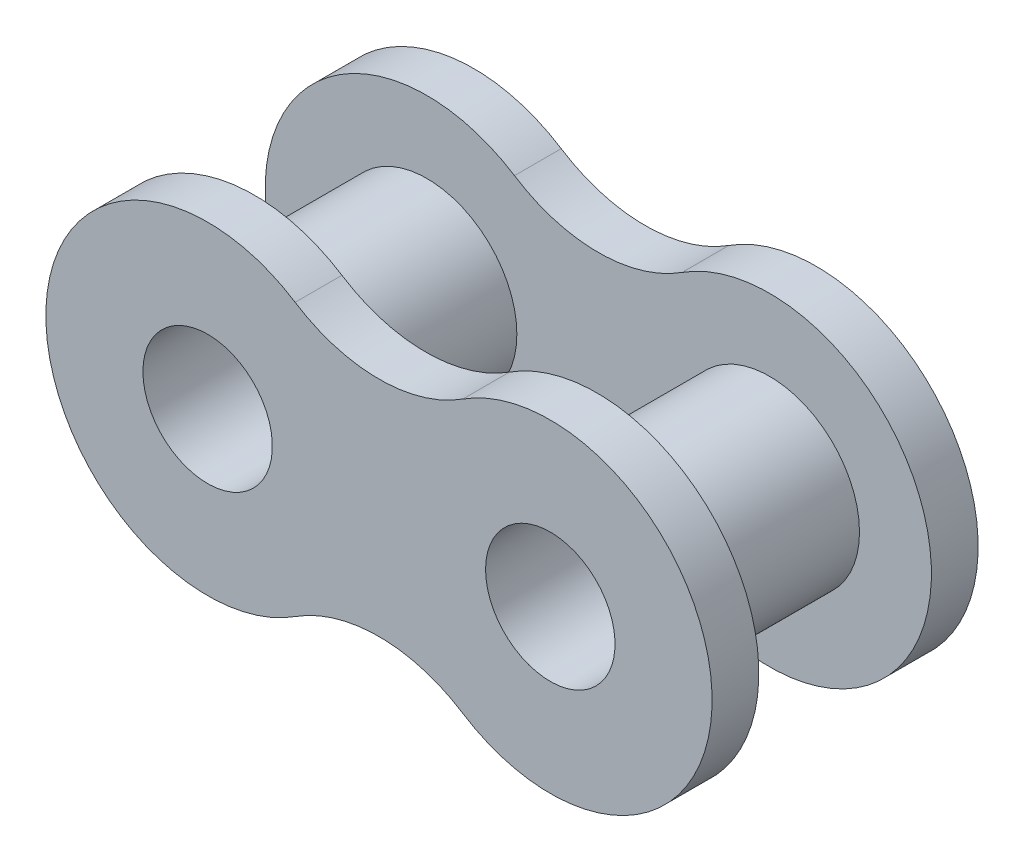
ISO-10303-21;
HEADER;
FILE_DESCRIPTION(('STEP AP214'),'2;1');
FILE_NAME('part.step','',(''),(''),'','','');
FILE_SCHEMA(('AUTOMOTIVE_DESIGN { 1 0 10303 214 1 1 1 1 }'));
ENDSEC;
DATA;
#1=APPLICATION_CONTEXT('core data for automotive mechanical design processes');
#2=APPLICATION_PROTOCOL_DEFINITION('international standard','automotive_design',2000,#1);
#3=PRODUCT_CONTEXT('',#1,'mechanical');
#4=PRODUCT('Part','Part','',(#3));
#5=PRODUCT_RELATED_PRODUCT_CATEGORY('part','',(#4));
#6=PRODUCT_DEFINITION_FORMATION('','',#4);
#7=PRODUCT_DEFINITION_CONTEXT('part definition',#1,'design');
#8=PRODUCT_DEFINITION('design','',#6,#7);
#9=PRODUCT_DEFINITION_SHAPE('','',#8);
#10=(LENGTH_UNIT() NAMED_UNIT(*) SI_UNIT(.MILLI.,.METRE.));
#11=(NAMED_UNIT(*) PLANE_ANGLE_UNIT() SI_UNIT($,.RADIAN.));
#12=(NAMED_UNIT(*) SI_UNIT($,.STERADIAN.) SOLID_ANGLE_UNIT());
#13=UNCERTAINTY_MEASURE_WITH_UNIT(LENGTH_MEASURE(1.E-05),#10,'distance_accuracy_value','');
#14=(GEOMETRIC_REPRESENTATION_CONTEXT(3) GLOBAL_UNCERTAINTY_ASSIGNED_CONTEXT((#13)) GLOBAL_UNIT_ASSIGNED_CONTEXT((#10,
#11,#12)) REPRESENTATION_CONTEXT('',''));
#15=CARTESIAN_POINT('',(0.,0.,0.));
#16=DIRECTION('',(0.,0.,1.));
#17=DIRECTION('',(1.,0.,0.));
#18=AXIS2_PLACEMENT_3D('',#15,#16,#17);
#19=CARTESIAN_POINT('',(-4.765,0.,6.3));
#20=DIRECTION('',(0.,0.,-1.));
#21=DIRECTION('',(-1.,0.,0.));
#22=AXIS2_PLACEMENT_3D('',#19,#20,#21);
#23=CYLINDRICAL_SURFACE('',#22,2.5);
#24=CARTESIAN_POINT('',(-4.765,0.,1.3));
#25=DIRECTION('',(0.,0.,-1.));
#26=DIRECTION('',(-1.,0.,0.));
#27=AXIS2_PLACEMENT_3D('',#24,#25,#26);
#28=CIRCLE('',#27,2.5);
#29=CARTESIAN_POINT('',(-7.265,0.,1.3));
#30=VERTEX_POINT('',#29);
#31=EDGE_CURVE('E185',#30,#30,#28,.F.);
#32=ORIENTED_EDGE('',*,*,#31,.T.);
#33=EDGE_LOOP('',(#32));
#34=FACE_BOUND('',#33,.T.);
#35=CARTESIAN_POINT('',(-4.765,0.,6.1));
#36=DIRECTION('',(0.,0.,1.));
#37=DIRECTION('',(1.,0.,0.));
#38=AXIS2_PLACEMENT_3D('',#35,#36,#37);
#39=CIRCLE('',#38,2.5);
#40=CARTESIAN_POINT('',(-2.265,0.,6.1));
#41=VERTEX_POINT('',#40);
#42=EDGE_CURVE('E11',#41,#41,#39,.T.);
#43=ORIENTED_EDGE('',*,*,#42,.F.);
#44=EDGE_LOOP('',(#43));
#45=FACE_BOUND('',#44,.T.);
#46=ADVANCED_FACE('F41',(#34,#45),#23,.T.);
#47=CARTESIAN_POINT('',(4.765,0.,6.3));
#48=DIRECTION('',(0.,0.,-1.));
#49=DIRECTION('',(-1.,0.,0.));
#50=AXIS2_PLACEMENT_3D('',#47,#48,#49);
#51=CYLINDRICAL_SURFACE('',#50,2.5);
#52=CARTESIAN_POINT('',(4.765,0.,1.3));
#53=DIRECTION('',(0.,0.,-1.));
#54=DIRECTION('',(-1.,0.,0.));
#55=AXIS2_PLACEMENT_3D('',#52,#53,#54);
#56=CIRCLE('',#55,2.5);
#57=CARTESIAN_POINT('',(2.265,0.,1.3));
#58=VERTEX_POINT('',#57);
#59=EDGE_CURVE('E45',#58,#58,#56,.F.);
#60=ORIENTED_EDGE('',*,*,#59,.T.);
#61=EDGE_LOOP('',(#60));
#62=FACE_BOUND('',#61,.T.);
#63=CARTESIAN_POINT('',(4.765,0.,6.1));
#64=DIRECTION('',(0.,0.,1.));
#65=DIRECTION('',(1.,0.,0.));
#66=AXIS2_PLACEMENT_3D('',#63,#64,#65);
#67=CIRCLE('',#66,2.5);
#68=CARTESIAN_POINT('',(7.265,0.,6.1));
#69=VERTEX_POINT('',#68);
#70=EDGE_CURVE('E51',#69,#69,#67,.T.);
#71=ORIENTED_EDGE('',*,*,#70,.F.);
#72=EDGE_LOOP('',(#71));
#73=FACE_BOUND('',#72,.T.);
#74=ADVANCED_FACE('F192',(#62,#73),#51,.T.);
#75=CARTESIAN_POINT('',(4.765,0.,1.3));
#76=DIRECTION('',(0.,0.,-1.));
#77=DIRECTION('',(-1.,0.,0.));
#78=AXIS2_PLACEMENT_3D('',#75,#76,#77);
#79=CYLINDRICAL_SURFACE('',#78,4.5);
#80=CARTESIAN_POINT('',(4.765,0.,0.));
#81=DIRECTION('',(0.,0.,1.));
#82=DIRECTION('',(-1.,0.,0.));
#83=AXIS2_PLACEMENT_3D('',#80,#81,#82);
#84=CIRCLE('',#83,4.5);
#85=CARTESIAN_POINT('',(2.33084421994934,-3.78482306567242,0.));
#86=VERTEX_POINT('',#85);
#87=CARTESIAN_POINT('',(2.33084421994934,3.78482306567242,0.));
#88=VERTEX_POINT('',#87);
#89=EDGE_CURVE('E130',#86,#88,#84,.T.);
#90=ORIENTED_EDGE('',*,*,#89,.T.);
#91=DIRECTION('',(0.,0.,-1.));
#92=VECTOR('',#91,1.);
#93=CARTESIAN_POINT('',(2.33084421994934,3.78482306567242,1.3));
#94=LINE('',#93,#92);
#95=CARTESIAN_POINT('',(2.33084421994934,3.78482306567242,1.3));
#96=VERTEX_POINT('',#95);
#97=EDGE_CURVE('E184',#96,#88,#94,.T.);
#98=ORIENTED_EDGE('',*,*,#97,.F.);
#99=CARTESIAN_POINT('',(4.765,0.,1.3));
#100=DIRECTION('',(0.,0.,1.));
#101=DIRECTION('',(-1.,0.,0.));
#102=AXIS2_PLACEMENT_3D('',#99,#100,#101);
#103=CIRCLE('',#102,4.5);
#104=CARTESIAN_POINT('',(2.33084421994934,-3.78482306567242,1.3));
#105=VERTEX_POINT('',#104);
#106=EDGE_CURVE('E166',#105,#96,#103,.T.);
#107=ORIENTED_EDGE('',*,*,#106,.F.);
#108=DIRECTION('',(0.,0.,-1.));
#109=VECTOR('',#108,1.);
#110=CARTESIAN_POINT('',(2.33084421994934,-3.78482306567242,1.3));
#111=LINE('',#110,#109);
#112=EDGE_CURVE('E172',#105,#86,#111,.T.);
#113=ORIENTED_EDGE('',*,*,#112,.T.);
#114=EDGE_LOOP('',(#90,#98,#107,#113));
#115=FACE_BOUND('',#114,.T.);
#116=ADVANCED_FACE('F43',(#115),#79,.T.);
#117=CARTESIAN_POINT('',(0.,7.40900892857143,1.3));
#118=DIRECTION('',(0.,0.,-1.));
#119=DIRECTION('',(-1.,0.,0.));
#120=AXIS2_PLACEMENT_3D('',#117,#118,#119);
#121=CYLINDRICAL_SURFACE('',#120,4.30900892857143);
#122=CARTESIAN_POINT('',(0.,7.40900892857143,0.));
#123=DIRECTION('',(0.,0.,-1.));
#124=DIRECTION('',(1.,0.,0.));
#125=AXIS2_PLACEMENT_3D('',#122,#123,#124);
#126=CIRCLE('',#125,4.30900892857143);
#127=CARTESIAN_POINT('',(-2.33084421994934,3.78482306567242,0.));
#128=VERTEX_POINT('',#127);
#129=EDGE_CURVE('E175',#88,#128,#126,.T.);
#130=ORIENTED_EDGE('',*,*,#129,.T.);
#131=DIRECTION('',(0.,0.,-1.));
#132=VECTOR('',#131,1.);
#133=CARTESIAN_POINT('',(-2.33084421994934,3.78482306567242,1.3));
#134=LINE('',#133,#132);
#135=CARTESIAN_POINT('',(-2.33084421994934,3.78482306567242,1.3));
#136=VERTEX_POINT('',#135);
#137=EDGE_CURVE('E182',#136,#128,#134,.T.);
#138=ORIENTED_EDGE('',*,*,#137,.F.);
#139=CARTESIAN_POINT('',(0.,7.40900892857143,1.3));
#140=DIRECTION('',(0.,0.,-1.));
#141=DIRECTION('',(1.,0.,0.));
#142=AXIS2_PLACEMENT_3D('',#139,#140,#141);
#143=CIRCLE('',#142,4.30900892857143);
#144=EDGE_CURVE('E92',#96,#136,#143,.T.);
#145=ORIENTED_EDGE('',*,*,#144,.F.);
#146=ORIENTED_EDGE('',*,*,#97,.T.);
#147=EDGE_LOOP('',(#130,#138,#145,#146));
#148=FACE_BOUND('',#147,.T.);
#149=ADVANCED_FACE('F205',(#148),#121,.F.);
#150=CARTESIAN_POINT('',(-4.765,0.,1.3));
#151=DIRECTION('',(0.,0.,-1.));
#152=DIRECTION('',(-1.,0.,0.));
#153=AXIS2_PLACEMENT_3D('',#150,#151,#152);
#154=CYLINDRICAL_SURFACE('',#153,4.5);
#155=CARTESIAN_POINT('',(-4.765,0.,0.));
#156=DIRECTION('',(0.,0.,1.));
#157=DIRECTION('',(1.,0.,0.));
#158=AXIS2_PLACEMENT_3D('',#155,#156,#157);
#159=CIRCLE('',#158,4.5);
#160=CARTESIAN_POINT('',(-2.33084421994934,-3.78482306567242,0.));
#161=VERTEX_POINT('',#160);
#162=EDGE_CURVE('E78',#128,#161,#159,.T.);
#163=ORIENTED_EDGE('',*,*,#162,.T.);
#164=DIRECTION('',(0.,0.,-1.));
#165=VECTOR('',#164,1.);
#166=CARTESIAN_POINT('',(-2.33084421994934,-3.78482306567242,1.3));
#167=LINE('',#166,#165);
#168=CARTESIAN_POINT('',(-2.33084421994934,-3.78482306567242,1.3));
#169=VERTEX_POINT('',#168);
#170=EDGE_CURVE('E180',#169,#161,#167,.T.);
#171=ORIENTED_EDGE('',*,*,#170,.F.);
#172=CARTESIAN_POINT('',(-4.765,0.,1.3));
#173=DIRECTION('',(0.,0.,1.));
#174=DIRECTION('',(1.,0.,0.));
#175=AXIS2_PLACEMENT_3D('',#172,#173,#174);
#176=CIRCLE('',#175,4.5);
#177=EDGE_CURVE('E169',#136,#169,#176,.T.);
#178=ORIENTED_EDGE('',*,*,#177,.F.);
#179=ORIENTED_EDGE('',*,*,#137,.T.);
#180=EDGE_LOOP('',(#163,#171,#178,#179));
#181=FACE_BOUND('',#180,.T.);
#182=ADVANCED_FACE('F208',(#181),#154,.T.);
#183=CARTESIAN_POINT('',(0.,-7.40900892857143,1.3));
#184=DIRECTION('',(0.,0.,-1.));
#185=DIRECTION('',(-1.,0.,0.));
#186=AXIS2_PLACEMENT_3D('',#183,#184,#185);
#187=CYLINDRICAL_SURFACE('',#186,4.30900892857143);
#188=CARTESIAN_POINT('',(0.,-7.40900892857143,0.));
#189=DIRECTION('',(0.,0.,-1.));
#190=DIRECTION('',(-1.,0.,0.));
#191=AXIS2_PLACEMENT_3D('',#188,#189,#190);
#192=CIRCLE('',#191,4.30900892857143);
#193=EDGE_CURVE('E84',#161,#86,#192,.T.);
#194=ORIENTED_EDGE('',*,*,#193,.T.);
#195=ORIENTED_EDGE('',*,*,#112,.F.);
#196=CARTESIAN_POINT('',(0.,-7.40900892857143,1.3));
#197=DIRECTION('',(0.,0.,-1.));
#198=DIRECTION('',(-1.,0.,0.));
#199=AXIS2_PLACEMENT_3D('',#196,#197,#198);
#200=CIRCLE('',#199,4.30900892857143);
#201=EDGE_CURVE('E60',#169,#105,#200,.T.);
#202=ORIENTED_EDGE('',*,*,#201,.F.);
#203=ORIENTED_EDGE('',*,*,#170,.T.);
#204=EDGE_LOOP('',(#194,#195,#202,#203));
#205=FACE_BOUND('',#204,.T.);
#206=ADVANCED_FACE('F199',(#205),#187,.F.);
#207=CARTESIAN_POINT('',(2.3825,-3.70450446428571,1.3));
#208=DIRECTION('',(0.,0.,-1.));
#209=DIRECTION('',(-1.,0.,0.));
#210=AXIS2_PLACEMENT_3D('',#207,#208,#209);
#211=PLANE('',#210);
#212=ORIENTED_EDGE('',*,*,#59,.F.);
#213=EDGE_LOOP('',(#212));
#214=FACE_BOUND('',#213,.T.);
#215=ORIENTED_EDGE('',*,*,#31,.F.);
#216=EDGE_LOOP('',(#215));
#217=FACE_BOUND('',#216,.T.);
#218=ORIENTED_EDGE('',*,*,#106,.T.);
#219=ORIENTED_EDGE('',*,*,#144,.T.);
#220=ORIENTED_EDGE('',*,*,#177,.T.);
#221=ORIENTED_EDGE('',*,*,#201,.T.);
#222=EDGE_LOOP('',(#218,#219,#220,#221));
#223=FACE_BOUND('',#222,.T.);
#224=ADVANCED_FACE('F195',(#214,#217,#223),#211,.F.);
#225=CARTESIAN_POINT('',(2.3825,-3.70450446428571,0.));
#226=DIRECTION('',(0.,0.,-1.));
#227=DIRECTION('',(-1.,0.,0.));
#228=AXIS2_PLACEMENT_3D('',#225,#226,#227);
#229=PLANE('',#228);
#230=CARTESIAN_POINT('',(4.765,0.,0.));
#231=DIRECTION('',(0.,0.,-1.));
#232=DIRECTION('',(-1.,0.,0.));
#233=AXIS2_PLACEMENT_3D('',#230,#231,#232);
#234=CIRCLE('',#233,1.8);
#235=CARTESIAN_POINT('',(2.965,0.,0.));
#236=VERTEX_POINT('',#235);
#237=EDGE_CURVE('E396',#236,#236,#234,.T.);
#238=ORIENTED_EDGE('',*,*,#237,.F.);
#239=EDGE_LOOP('',(#238));
#240=FACE_BOUND('',#239,.T.);
#241=CARTESIAN_POINT('',(-4.765,0.,0.));
#242=DIRECTION('',(0.,0.,-1.));
#243=DIRECTION('',(-1.,0.,0.));
#244=AXIS2_PLACEMENT_3D('',#241,#242,#243);
#245=CIRCLE('',#244,1.8);
#246=CARTESIAN_POINT('',(-6.565,0.,0.));
#247=VERTEX_POINT('',#246);
#248=EDGE_CURVE('E397',#247,#247,#245,.T.);
#249=ORIENTED_EDGE('',*,*,#248,.F.);
#250=EDGE_LOOP('',(#249));
#251=FACE_BOUND('',#250,.T.);
#252=ORIENTED_EDGE('',*,*,#89,.F.);
#253=ORIENTED_EDGE('',*,*,#193,.F.);
#254=ORIENTED_EDGE('',*,*,#162,.F.);
#255=ORIENTED_EDGE('',*,*,#129,.F.);
#256=EDGE_LOOP('',(#252,#253,#254,#255));
#257=FACE_BOUND('',#256,.T.);
#258=ADVANCED_FACE('F198',(#240,#251,#257),#229,.T.);
#259=CARTESIAN_POINT('',(2.3825,-3.70450446428571,7.4));
#260=DIRECTION('',(0.,0.,1.));
#261=DIRECTION('',(-1.,0.,0.));
#262=AXIS2_PLACEMENT_3D('',#259,#260,#261);
#263=PLANE('',#262);
#264=CARTESIAN_POINT('',(4.765,0.,7.4));
#265=DIRECTION('',(0.,0.,-1.));
#266=DIRECTION('',(-1.,0.,0.));
#267=AXIS2_PLACEMENT_3D('',#264,#265,#266);
#268=CIRCLE('',#267,1.8);
#269=CARTESIAN_POINT('',(2.965,0.,7.4));
#270=VERTEX_POINT('',#269);
#271=EDGE_CURVE('E153',#270,#270,#268,.T.);
#272=ORIENTED_EDGE('',*,*,#271,.T.);
#273=EDGE_LOOP('',(#272));
#274=FACE_BOUND('',#273,.T.);
#275=CARTESIAN_POINT('',(-4.765,0.,7.4));
#276=DIRECTION('',(0.,0.,-1.));
#277=DIRECTION('',(-1.,0.,0.));
#278=AXIS2_PLACEMENT_3D('',#275,#276,#277);
#279=CIRCLE('',#278,1.8);
#280=CARTESIAN_POINT('',(-6.565,0.,7.4));
#281=VERTEX_POINT('',#280);
#282=EDGE_CURVE('E401',#281,#281,#279,.T.);
#283=ORIENTED_EDGE('',*,*,#282,.T.);
#284=EDGE_LOOP('',(#283));
#285=FACE_BOUND('',#284,.T.);
#286=CARTESIAN_POINT('',(4.765,0.,7.4));
#287=DIRECTION('',(0.,0.,1.));
#288=DIRECTION('',(-1.,0.,0.));
#289=AXIS2_PLACEMENT_3D('',#286,#287,#288);
#290=CIRCLE('',#289,4.5);
#291=CARTESIAN_POINT('',(2.33084421994934,-3.78482306567242,7.4));
#292=VERTEX_POINT('',#291);
#293=CARTESIAN_POINT('',(2.33084421994934,3.78482306567242,7.4));
#294=VERTEX_POINT('',#293);
#295=EDGE_CURVE('E125',#292,#294,#290,.T.);
#296=ORIENTED_EDGE('',*,*,#295,.T.);
#297=CARTESIAN_POINT('',(0.,7.40900892857143,7.4));
#298=DIRECTION('',(0.,0.,-1.));
#299=DIRECTION('',(1.,0.,0.));
#300=AXIS2_PLACEMENT_3D('',#297,#298,#299);
#301=CIRCLE('',#300,4.30900892857143);
#302=CARTESIAN_POINT('',(-2.33084421994934,3.78482306567242,7.4));
#303=VERTEX_POINT('',#302);
#304=EDGE_CURVE('E141',#294,#303,#301,.T.);
#305=ORIENTED_EDGE('',*,*,#304,.T.);
#306=CARTESIAN_POINT('',(-4.765,0.,7.4));
#307=DIRECTION('',(0.,0.,1.));
#308=DIRECTION('',(1.,0.,0.));
#309=AXIS2_PLACEMENT_3D('',#306,#307,#308);
#310=CIRCLE('',#309,4.5);
#311=CARTESIAN_POINT('',(-2.33084421994934,-3.78482306567242,7.4));
#312=VERTEX_POINT('',#311);
#313=EDGE_CURVE('E155',#303,#312,#310,.T.);
#314=ORIENTED_EDGE('',*,*,#313,.T.);
#315=CARTESIAN_POINT('',(0.,-7.40900892857143,7.4));
#316=DIRECTION('',(0.,0.,-1.));
#317=DIRECTION('',(-1.,0.,0.));
#318=AXIS2_PLACEMENT_3D('',#315,#316,#317);
#319=CIRCLE('',#318,4.30900892857143);
#320=EDGE_CURVE('E152',#312,#292,#319,.T.);
#321=ORIENTED_EDGE('',*,*,#320,.T.);
#322=EDGE_LOOP('',(#296,#305,#314,#321));
#323=FACE_BOUND('',#322,.T.);
#324=ADVANCED_FACE('F210',(#274,#285,#323),#263,.T.);
#325=CARTESIAN_POINT('',(2.3825,-3.70450446428571,6.1));
#326=DIRECTION('',(0.,0.,1.));
#327=DIRECTION('',(-1.,0.,0.));
#328=AXIS2_PLACEMENT_3D('',#325,#326,#327);
#329=PLANE('',#328);
#330=ORIENTED_EDGE('',*,*,#42,.T.);
#331=EDGE_LOOP('',(#330));
#332=FACE_BOUND('',#331,.T.);
#333=ORIENTED_EDGE('',*,*,#70,.T.);
#334=EDGE_LOOP('',(#333));
#335=FACE_BOUND('',#334,.T.);
#336=CARTESIAN_POINT('',(4.765,0.,6.1));
#337=DIRECTION('',(0.,0.,1.));
#338=DIRECTION('',(-1.,0.,0.));
#339=AXIS2_PLACEMENT_3D('',#336,#337,#338);
#340=CIRCLE('',#339,4.5);
#341=CARTESIAN_POINT('',(2.33084421994934,-3.78482306567242,6.1));
#342=VERTEX_POINT('',#341);
#343=CARTESIAN_POINT('',(2.33084421994934,3.78482306567242,6.1));
#344=VERTEX_POINT('',#343);
#345=EDGE_CURVE('E122',#342,#344,#340,.T.);
#346=ORIENTED_EDGE('',*,*,#345,.F.);
#347=CARTESIAN_POINT('',(0.,-7.40900892857143,6.1));
#348=DIRECTION('',(0.,0.,-1.));
#349=DIRECTION('',(-1.,0.,0.));
#350=AXIS2_PLACEMENT_3D('',#347,#348,#349);
#351=CIRCLE('',#350,4.30900892857143);
#352=CARTESIAN_POINT('',(-2.33084421994934,-3.78482306567242,6.1));
#353=VERTEX_POINT('',#352);
#354=EDGE_CURVE('E137',#353,#342,#351,.T.);
#355=ORIENTED_EDGE('',*,*,#354,.F.);
#356=CARTESIAN_POINT('',(-4.765,0.,6.1));
#357=DIRECTION('',(0.,0.,1.));
#358=DIRECTION('',(1.,0.,0.));
#359=AXIS2_PLACEMENT_3D('',#356,#357,#358);
#360=CIRCLE('',#359,4.5);
#361=CARTESIAN_POINT('',(-2.33084421994934,3.78482306567242,6.1));
#362=VERTEX_POINT('',#361);
#363=EDGE_CURVE('E144',#362,#353,#360,.T.);
#364=ORIENTED_EDGE('',*,*,#363,.F.);
#365=CARTESIAN_POINT('',(0.,7.40900892857143,6.1));
#366=DIRECTION('',(0.,0.,-1.));
#367=DIRECTION('',(1.,0.,0.));
#368=AXIS2_PLACEMENT_3D('',#365,#366,#367);
#369=CIRCLE('',#368,4.30900892857143);
#370=EDGE_CURVE('E140',#344,#362,#369,.T.);
#371=ORIENTED_EDGE('',*,*,#370,.F.);
#372=EDGE_LOOP('',(#346,#355,#364,#371));
#373=FACE_BOUND('',#372,.T.);
#374=ADVANCED_FACE('F135',(#332,#335,#373),#329,.F.);
#375=CARTESIAN_POINT('',(0.,7.40900892857143,6.1));
#376=DIRECTION('',(0.,0.,1.));
#377=DIRECTION('',(1.,0.,0.));
#378=AXIS2_PLACEMENT_3D('',#375,#376,#377);
#379=CYLINDRICAL_SURFACE('',#378,4.30900892857143);
#380=ORIENTED_EDGE('',*,*,#304,.F.);
#381=DIRECTION('',(0.,0.,1.));
#382=VECTOR('',#381,1.);
#383=CARTESIAN_POINT('',(2.33084421994934,3.78482306567242,6.1));
#384=LINE('',#383,#382);
#385=EDGE_CURVE('E150',#344,#294,#384,.T.);
#386=ORIENTED_EDGE('',*,*,#385,.F.);
#387=ORIENTED_EDGE('',*,*,#370,.T.);
#388=DIRECTION('',(0.,0.,1.));
#389=VECTOR('',#388,1.);
#390=CARTESIAN_POINT('',(-2.33084421994934,3.78482306567242,6.1));
#391=LINE('',#390,#389);
#392=EDGE_CURVE('E161',#362,#303,#391,.T.);
#393=ORIENTED_EDGE('',*,*,#392,.T.);
#394=EDGE_LOOP('',(#380,#386,#387,#393));
#395=FACE_BOUND('',#394,.T.);
#396=ADVANCED_FACE('F244',(#395),#379,.F.);
#397=CARTESIAN_POINT('',(-4.765,0.,6.1));
#398=DIRECTION('',(0.,0.,1.));
#399=DIRECTION('',(1.,0.,0.));
#400=AXIS2_PLACEMENT_3D('',#397,#398,#399);
#401=CYLINDRICAL_SURFACE('',#400,4.5);
#402=ORIENTED_EDGE('',*,*,#313,.F.);
#403=ORIENTED_EDGE('',*,*,#392,.F.);
#404=ORIENTED_EDGE('',*,*,#363,.T.);
#405=DIRECTION('',(0.,0.,1.));
#406=VECTOR('',#405,1.);
#407=CARTESIAN_POINT('',(-2.33084421994934,-3.78482306567242,6.1));
#408=LINE('',#407,#406);
#409=EDGE_CURVE('E131',#353,#312,#408,.T.);
#410=ORIENTED_EDGE('',*,*,#409,.T.);
#411=EDGE_LOOP('',(#402,#403,#404,#410));
#412=FACE_BOUND('',#411,.T.);
#413=ADVANCED_FACE('F241',(#412),#401,.T.);
#414=CARTESIAN_POINT('',(0.,-7.40900892857143,6.1));
#415=DIRECTION('',(0.,0.,1.));
#416=DIRECTION('',(1.,0.,0.));
#417=AXIS2_PLACEMENT_3D('',#414,#415,#416);
#418=CYLINDRICAL_SURFACE('',#417,4.30900892857143);
#419=ORIENTED_EDGE('',*,*,#320,.F.);
#420=ORIENTED_EDGE('',*,*,#409,.F.);
#421=ORIENTED_EDGE('',*,*,#354,.T.);
#422=DIRECTION('',(0.,0.,1.));
#423=VECTOR('',#422,1.);
#424=CARTESIAN_POINT('',(2.33084421994934,-3.78482306567242,6.1));
#425=LINE('',#424,#423);
#426=EDGE_CURVE('E119',#342,#292,#425,.T.);
#427=ORIENTED_EDGE('',*,*,#426,.T.);
#428=EDGE_LOOP('',(#419,#420,#421,#427));
#429=FACE_BOUND('',#428,.T.);
#430=ADVANCED_FACE('F143',(#429),#418,.F.);
#431=CARTESIAN_POINT('',(4.765,0.,6.1));
#432=DIRECTION('',(0.,0.,1.));
#433=DIRECTION('',(1.,0.,0.));
#434=AXIS2_PLACEMENT_3D('',#431,#432,#433);
#435=CYLINDRICAL_SURFACE('',#434,4.5);
#436=ORIENTED_EDGE('',*,*,#295,.F.);
#437=ORIENTED_EDGE('',*,*,#426,.F.);
#438=ORIENTED_EDGE('',*,*,#345,.T.);
#439=ORIENTED_EDGE('',*,*,#385,.T.);
#440=EDGE_LOOP('',(#436,#437,#438,#439));
#441=FACE_BOUND('',#440,.T.);
#442=ADVANCED_FACE('F121',(#441),#435,.T.);
#443=CARTESIAN_POINT('',(4.765,0.,6.3));
#444=DIRECTION('',(0.,0.,-1.));
#445=DIRECTION('',(-1.,0.,0.));
#446=AXIS2_PLACEMENT_3D('',#443,#444,#445);
#447=CYLINDRICAL_SURFACE('',#446,1.8);
#448=ORIENTED_EDGE('',*,*,#271,.F.);
#449=EDGE_LOOP('',(#448));
#450=FACE_BOUND('',#449,.T.);
#451=ORIENTED_EDGE('',*,*,#237,.T.);
#452=EDGE_LOOP('',(#451));
#453=FACE_BOUND('',#452,.T.);
#454=ADVANCED_FACE('F232',(#450,#453),#447,.F.);
#455=CARTESIAN_POINT('',(-4.765,0.,6.3));
#456=DIRECTION('',(0.,0.,-1.));
#457=DIRECTION('',(-1.,0.,0.));
#458=AXIS2_PLACEMENT_3D('',#455,#456,#457);
#459=CYLINDRICAL_SURFACE('',#458,1.8);
#460=ORIENTED_EDGE('',*,*,#282,.F.);
#461=EDGE_LOOP('',(#460));
#462=FACE_BOUND('',#461,.T.);
#463=ORIENTED_EDGE('',*,*,#248,.T.);
#464=EDGE_LOOP('',(#463));
#465=FACE_BOUND('',#464,.T.);
#466=ADVANCED_FACE('F229',(#462,#465),#459,.F.);
#467=CLOSED_SHELL('',(#46,#74,#116,#149,#182,#206,#224,#258,#324,#374,#396,#413,#430,#442,#454,#466));
#468=MANIFOLD_SOLID_BREP('B2',#467);
#469=ADVANCED_BREP_SHAPE_REPRESENTATION('',(#18,#468),#14);
#470=SHAPE_DEFINITION_REPRESENTATION(#9,#469);
ENDSEC;
END-ISO-10303-21;
